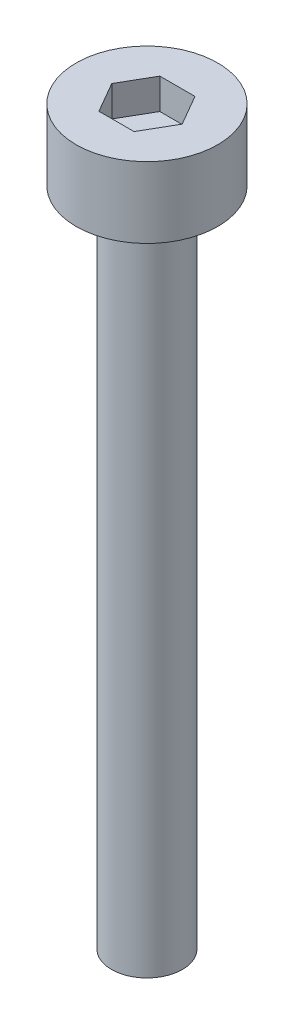
ISO-10303-21;
HEADER;
FILE_DESCRIPTION(('STEP AP214'),'2;1');
FILE_NAME('part.step','',(''),(''),'','','');
FILE_SCHEMA(('AUTOMOTIVE_DESIGN { 1 0 10303 214 1 1 1 1 }'));
ENDSEC;
DATA;
#1=APPLICATION_CONTEXT('core data for automotive mechanical design processes');
#2=APPLICATION_PROTOCOL_DEFINITION('international standard','automotive_design',2000,#1);
#3=PRODUCT_CONTEXT('',#1,'mechanical');
#4=PRODUCT('Part','Part','',(#3));
#5=PRODUCT_RELATED_PRODUCT_CATEGORY('part','',(#4));
#6=PRODUCT_DEFINITION_FORMATION('','',#4);
#7=PRODUCT_DEFINITION_CONTEXT('part definition',#1,'design');
#8=PRODUCT_DEFINITION('design','',#6,#7);
#9=PRODUCT_DEFINITION_SHAPE('','',#8);
#10=(LENGTH_UNIT() NAMED_UNIT(*) SI_UNIT(.MILLI.,.METRE.));
#11=(NAMED_UNIT(*) PLANE_ANGLE_UNIT() SI_UNIT($,.RADIAN.));
#12=(NAMED_UNIT(*) SI_UNIT($,.STERADIAN.) SOLID_ANGLE_UNIT());
#13=UNCERTAINTY_MEASURE_WITH_UNIT(LENGTH_MEASURE(1.E-05),#10,'distance_accuracy_value','');
#14=(GEOMETRIC_REPRESENTATION_CONTEXT(3) GLOBAL_UNCERTAINTY_ASSIGNED_CONTEXT((#13)) GLOBAL_UNIT_ASSIGNED_CONTEXT((#10,
#11,#12)) REPRESENTATION_CONTEXT('',''));
#15=CARTESIAN_POINT('',(0.,0.,0.));
#16=DIRECTION('',(0.,0.,1.));
#17=DIRECTION('',(1.,0.,0.));
#18=AXIS2_PLACEMENT_3D('',#15,#16,#17);
#19=CARTESIAN_POINT('',(0.,28.,0.));
#20=DIRECTION('',(0.,-1.,0.));
#21=DIRECTION('',(0.,0.,-1.));
#22=AXIS2_PLACEMENT_3D('',#19,#20,#21);
#23=CYLINDRICAL_SURFACE('',#22,1.5);
#24=CARTESIAN_POINT('',(0.,28.,0.));
#25=DIRECTION('',(0.,1.,0.));
#26=DIRECTION('',(0.,0.,1.));
#27=AXIS2_PLACEMENT_3D('',#24,#25,#26);
#28=CIRCLE('',#27,1.5);
#29=CARTESIAN_POINT('',(0.,28.,1.5));
#30=VERTEX_POINT('',#29);
#31=EDGE_CURVE('E11',#30,#30,#28,.T.);
#32=ORIENTED_EDGE('',*,*,#31,.F.);
#33=EDGE_LOOP('',(#32));
#34=FACE_BOUND('',#33,.T.);
#35=CARTESIAN_POINT('',(0.,0.,0.));
#36=DIRECTION('',(0.,1.,0.));
#37=DIRECTION('',(0.,0.,1.));
#38=AXIS2_PLACEMENT_3D('',#35,#36,#37);
#39=CIRCLE('',#38,1.5);
#40=CARTESIAN_POINT('',(0.,0.,1.5));
#41=VERTEX_POINT('',#40);
#42=EDGE_CURVE('E38',#41,#41,#39,.T.);
#43=ORIENTED_EDGE('',*,*,#42,.T.);
#44=EDGE_LOOP('',(#43));
#45=FACE_BOUND('',#44,.T.);
#46=ADVANCED_FACE('F35',(#34,#45),#23,.T.);
#47=CARTESIAN_POINT('',(0.,0.,0.));
#48=DIRECTION('',(0.,1.,0.));
#49=DIRECTION('',(0.,0.,1.));
#50=AXIS2_PLACEMENT_3D('',#47,#48,#49);
#51=PLANE('',#50);
#52=ORIENTED_EDGE('',*,*,#42,.F.);
#53=EDGE_LOOP('',(#52));
#54=FACE_BOUND('',#53,.T.);
#55=ADVANCED_FACE('F167',(#54),#51,.F.);
#56=CARTESIAN_POINT('',(0.,31.,0.));
#57=DIRECTION('',(0.,-1.,0.));
#58=DIRECTION('',(0.,0.,-1.));
#59=AXIS2_PLACEMENT_3D('',#56,#57,#58);
#60=CYLINDRICAL_SURFACE('',#59,3.);
#61=CARTESIAN_POINT('',(0.,31.,0.));
#62=DIRECTION('',(0.,1.,0.));
#63=DIRECTION('',(0.,0.,1.));
#64=AXIS2_PLACEMENT_3D('',#61,#62,#63);
#65=CIRCLE('',#64,3.);
#66=CARTESIAN_POINT('',(0.,31.,3.));
#67=VERTEX_POINT('',#66);
#68=EDGE_CURVE('E142',#67,#67,#65,.T.);
#69=ORIENTED_EDGE('',*,*,#68,.F.);
#70=EDGE_LOOP('',(#69));
#71=FACE_BOUND('',#70,.T.);
#72=CARTESIAN_POINT('',(0.,28.,0.));
#73=DIRECTION('',(0.,1.,0.));
#74=DIRECTION('',(0.,0.,1.));
#75=AXIS2_PLACEMENT_3D('',#72,#73,#74);
#76=CIRCLE('',#75,3.);
#77=CARTESIAN_POINT('',(0.,28.,3.));
#78=VERTEX_POINT('',#77);
#79=EDGE_CURVE('E136',#78,#78,#76,.T.);
#80=ORIENTED_EDGE('',*,*,#79,.T.);
#81=EDGE_LOOP('',(#80));
#82=FACE_BOUND('',#81,.T.);
#83=ADVANCED_FACE('F149',(#71,#82),#60,.T.);
#84=CARTESIAN_POINT('',(0.,31.,0.));
#85=DIRECTION('',(0.,1.,0.));
#86=DIRECTION('',(0.,0.,1.));
#87=AXIS2_PLACEMENT_3D('',#84,#85,#86);
#88=PLANE('',#87);
#89=DIRECTION('',(0.5,0.,-0.866025403784439));
#90=VECTOR('',#89,1.);
#91=CARTESIAN_POINT('',(0.744781847254617,31.,1.29));
#92=LINE('',#91,#90);
#93=CARTESIAN_POINT('',(0.744781847254617,31.,1.29));
#94=VERTEX_POINT('',#93);
#95=CARTESIAN_POINT('',(1.48956369450923,31.,0.));
#96=VERTEX_POINT('',#95);
#97=EDGE_CURVE('E49',#94,#96,#92,.T.);
#98=ORIENTED_EDGE('',*,*,#97,.F.);
#99=DIRECTION('',(1.,0.,0.));
#100=VECTOR('',#99,1.);
#101=CARTESIAN_POINT('',(-0.744781847254617,31.,1.29));
#102=LINE('',#101,#100);
#103=CARTESIAN_POINT('',(-0.744781847254617,31.,1.29));
#104=VERTEX_POINT('',#103);
#105=EDGE_CURVE('E132',#104,#94,#102,.T.);
#106=ORIENTED_EDGE('',*,*,#105,.F.);
#107=DIRECTION('',(0.5,0.,0.866025403784439));
#108=VECTOR('',#107,1.);
#109=CARTESIAN_POINT('',(-1.48956369450923,31.,0.));
#110=LINE('',#109,#108);
#111=CARTESIAN_POINT('',(-1.48956369450923,31.,0.));
#112=VERTEX_POINT('',#111);
#113=EDGE_CURVE('E130',#112,#104,#110,.T.);
#114=ORIENTED_EDGE('',*,*,#113,.F.);
#115=DIRECTION('',(-0.5,0.,0.866025403784439));
#116=VECTOR('',#115,1.);
#117=CARTESIAN_POINT('',(-0.744781847254617,31.,-1.29));
#118=LINE('',#117,#116);
#119=CARTESIAN_POINT('',(-0.744781847254617,31.,-1.29));
#120=VERTEX_POINT('',#119);
#121=EDGE_CURVE('E97',#120,#112,#118,.T.);
#122=ORIENTED_EDGE('',*,*,#121,.F.);
#123=DIRECTION('',(-1.,0.,0.));
#124=VECTOR('',#123,1.);
#125=CARTESIAN_POINT('',(0.744781847254618,31.,-1.29));
#126=LINE('',#125,#124);
#127=CARTESIAN_POINT('',(0.744781847254618,31.,-1.29));
#128=VERTEX_POINT('',#127);
#129=EDGE_CURVE('E126',#128,#120,#126,.T.);
#130=ORIENTED_EDGE('',*,*,#129,.F.);
#131=DIRECTION('',(-0.5,0.,-0.866025403784439));
#132=VECTOR('',#131,1.);
#133=CARTESIAN_POINT('',(1.48956369450923,31.,0.));
#134=LINE('',#133,#132);
#135=EDGE_CURVE('E123',#96,#128,#134,.T.);
#136=ORIENTED_EDGE('',*,*,#135,.F.);
#137=EDGE_LOOP('',(#98,#106,#114,#122,#130,#136));
#138=FACE_BOUND('',#137,.T.);
#139=ORIENTED_EDGE('',*,*,#68,.T.);
#140=EDGE_LOOP('',(#139));
#141=FACE_BOUND('',#140,.T.);
#142=ADVANCED_FACE('F154',(#138,#141),#88,.T.);
#143=CARTESIAN_POINT('',(0.,28.,0.));
#144=DIRECTION('',(0.,1.,0.));
#145=DIRECTION('',(0.,0.,1.));
#146=AXIS2_PLACEMENT_3D('',#143,#144,#145);
#147=PLANE('',#146);
#148=ORIENTED_EDGE('',*,*,#31,.T.);
#149=EDGE_LOOP('',(#148));
#150=FACE_BOUND('',#149,.T.);
#151=ORIENTED_EDGE('',*,*,#79,.F.);
#152=EDGE_LOOP('',(#151));
#153=FACE_BOUND('',#152,.T.);
#154=ADVANCED_FACE('F151',(#150,#153),#147,.F.);
#155=CARTESIAN_POINT('',(0.744781847254617,29.7,1.29));
#156=DIRECTION('',(0.866025403784439,0.,0.5));
#157=DIRECTION('',(0.5,0.,-0.866025403784439));
#158=AXIS2_PLACEMENT_3D('',#155,#156,#157);
#159=PLANE('',#158);
#160=ORIENTED_EDGE('',*,*,#97,.T.);
#161=DIRECTION('',(0.,1.,0.));
#162=VECTOR('',#161,1.);
#163=CARTESIAN_POINT('',(1.48956369450923,29.7,0.));
#164=LINE('',#163,#162);
#165=CARTESIAN_POINT('',(1.48956369450923,29.7,0.));
#166=VERTEX_POINT('',#165);
#167=EDGE_CURVE('E79',#166,#96,#164,.T.);
#168=ORIENTED_EDGE('',*,*,#167,.F.);
#169=DIRECTION('',(0.5,0.,-0.866025403784439));
#170=VECTOR('',#169,1.);
#171=CARTESIAN_POINT('',(0.744781847254617,29.7,1.29));
#172=LINE('',#171,#170);
#173=CARTESIAN_POINT('',(0.744781847254617,29.7,1.29));
#174=VERTEX_POINT('',#173);
#175=EDGE_CURVE('E134',#174,#166,#172,.T.);
#176=ORIENTED_EDGE('',*,*,#175,.F.);
#177=DIRECTION('',(0.,1.,0.));
#178=VECTOR('',#177,1.);
#179=CARTESIAN_POINT('',(0.744781847254617,29.7,1.29));
#180=LINE('',#179,#178);
#181=EDGE_CURVE('E57',#174,#94,#180,.T.);
#182=ORIENTED_EDGE('',*,*,#181,.T.);
#183=EDGE_LOOP('',(#160,#168,#176,#182));
#184=FACE_BOUND('',#183,.T.);
#185=ADVANCED_FACE('F153',(#184),#159,.F.);
#186=CARTESIAN_POINT('',(-0.744781847254617,29.7,1.29));
#187=DIRECTION('',(0.,0.,1.));
#188=DIRECTION('',(1.,0.,0.));
#189=AXIS2_PLACEMENT_3D('',#186,#187,#188);
#190=PLANE('',#189);
#191=ORIENTED_EDGE('',*,*,#105,.T.);
#192=ORIENTED_EDGE('',*,*,#181,.F.);
#193=DIRECTION('',(1.,0.,0.));
#194=VECTOR('',#193,1.);
#195=CARTESIAN_POINT('',(-0.744781847254617,29.7,1.29));
#196=LINE('',#195,#194);
#197=CARTESIAN_POINT('',(-0.744781847254617,29.7,1.29));
#198=VERTEX_POINT('',#197);
#199=EDGE_CURVE('E109',#198,#174,#196,.T.);
#200=ORIENTED_EDGE('',*,*,#199,.F.);
#201=DIRECTION('',(0.,1.,0.));
#202=VECTOR('',#201,1.);
#203=CARTESIAN_POINT('',(-0.744781847254617,29.7,1.29));
#204=LINE('',#203,#202);
#205=EDGE_CURVE('E101',#198,#104,#204,.T.);
#206=ORIENTED_EDGE('',*,*,#205,.T.);
#207=EDGE_LOOP('',(#191,#192,#200,#206));
#208=FACE_BOUND('',#207,.T.);
#209=ADVANCED_FACE('F161',(#208),#190,.F.);
#210=CARTESIAN_POINT('',(-1.48956369450923,29.7,0.));
#211=DIRECTION('',(-0.866025403784439,0.,0.5));
#212=DIRECTION('',(0.5,0.,0.866025403784439));
#213=AXIS2_PLACEMENT_3D('',#210,#211,#212);
#214=PLANE('',#213);
#215=ORIENTED_EDGE('',*,*,#113,.T.);
#216=ORIENTED_EDGE('',*,*,#205,.F.);
#217=DIRECTION('',(0.5,0.,0.866025403784439));
#218=VECTOR('',#217,1.);
#219=CARTESIAN_POINT('',(-1.48956369450923,29.7,0.));
#220=LINE('',#219,#218);
#221=CARTESIAN_POINT('',(-1.48956369450923,29.7,0.));
#222=VERTEX_POINT('',#221);
#223=EDGE_CURVE('E105',#222,#198,#220,.T.);
#224=ORIENTED_EDGE('',*,*,#223,.F.);
#225=DIRECTION('',(0.,1.,0.));
#226=VECTOR('',#225,1.);
#227=CARTESIAN_POINT('',(-1.48956369450923,29.7,0.));
#228=LINE('',#227,#226);
#229=EDGE_CURVE('E90',#222,#112,#228,.T.);
#230=ORIENTED_EDGE('',*,*,#229,.T.);
#231=EDGE_LOOP('',(#215,#216,#224,#230));
#232=FACE_BOUND('',#231,.T.);
#233=ADVANCED_FACE('F106',(#232),#214,.F.);
#234=CARTESIAN_POINT('',(-0.744781847254617,29.7,-1.29));
#235=DIRECTION('',(-0.866025403784439,0.,-0.5));
#236=DIRECTION('',(-0.5,0.,0.866025403784439));
#237=AXIS2_PLACEMENT_3D('',#234,#235,#236);
#238=PLANE('',#237);
#239=ORIENTED_EDGE('',*,*,#121,.T.);
#240=ORIENTED_EDGE('',*,*,#229,.F.);
#241=DIRECTION('',(-0.5,0.,0.866025403784439));
#242=VECTOR('',#241,1.);
#243=CARTESIAN_POINT('',(-0.744781847254617,29.7,-1.29));
#244=LINE('',#243,#242);
#245=CARTESIAN_POINT('',(-0.744781847254617,29.7,-1.29));
#246=VERTEX_POINT('',#245);
#247=EDGE_CURVE('E94',#246,#222,#244,.T.);
#248=ORIENTED_EDGE('',*,*,#247,.F.);
#249=DIRECTION('',(0.,1.,0.));
#250=VECTOR('',#249,1.);
#251=CARTESIAN_POINT('',(-0.744781847254617,29.7,-1.29));
#252=LINE('',#251,#250);
#253=EDGE_CURVE('E102',#246,#120,#252,.T.);
#254=ORIENTED_EDGE('',*,*,#253,.T.);
#255=EDGE_LOOP('',(#239,#240,#248,#254));
#256=FACE_BOUND('',#255,.T.);
#257=ADVANCED_FACE('F92',(#256),#238,.F.);
#258=CARTESIAN_POINT('',(0.744781847254618,29.7,-1.29));
#259=DIRECTION('',(0.,0.,-1.));
#260=DIRECTION('',(-1.,0.,0.));
#261=AXIS2_PLACEMENT_3D('',#258,#259,#260);
#262=PLANE('',#261);
#263=ORIENTED_EDGE('',*,*,#129,.T.);
#264=ORIENTED_EDGE('',*,*,#253,.F.);
#265=DIRECTION('',(-1.,0.,0.));
#266=VECTOR('',#265,1.);
#267=CARTESIAN_POINT('',(0.744781847254618,29.7,-1.29));
#268=LINE('',#267,#266);
#269=CARTESIAN_POINT('',(0.744781847254618,29.7,-1.29));
#270=VERTEX_POINT('',#269);
#271=EDGE_CURVE('E115',#270,#246,#268,.T.);
#272=ORIENTED_EDGE('',*,*,#271,.F.);
#273=DIRECTION('',(0.,1.,0.));
#274=VECTOR('',#273,1.);
#275=CARTESIAN_POINT('',(0.744781847254618,29.7,-1.29));
#276=LINE('',#275,#274);
#277=EDGE_CURVE('E139',#270,#128,#276,.T.);
#278=ORIENTED_EDGE('',*,*,#277,.T.);
#279=EDGE_LOOP('',(#263,#264,#272,#278));
#280=FACE_BOUND('',#279,.T.);
#281=ADVANCED_FACE('F222',(#280),#262,.F.);
#282=CARTESIAN_POINT('',(1.48956369450923,29.7,0.));
#283=DIRECTION('',(0.866025403784439,0.,-0.5));
#284=DIRECTION('',(-0.5,0.,-0.866025403784439));
#285=AXIS2_PLACEMENT_3D('',#282,#283,#284);
#286=PLANE('',#285);
#287=ORIENTED_EDGE('',*,*,#135,.T.);
#288=ORIENTED_EDGE('',*,*,#277,.F.);
#289=DIRECTION('',(-0.5,0.,-0.866025403784439));
#290=VECTOR('',#289,1.);
#291=CARTESIAN_POINT('',(1.48956369450923,29.7,0.));
#292=LINE('',#291,#290);
#293=EDGE_CURVE('E117',#166,#270,#292,.T.);
#294=ORIENTED_EDGE('',*,*,#293,.F.);
#295=ORIENTED_EDGE('',*,*,#167,.T.);
#296=EDGE_LOOP('',(#287,#288,#294,#295));
#297=FACE_BOUND('',#296,.T.);
#298=ADVANCED_FACE('F231',(#297),#286,.F.);
#299=CARTESIAN_POINT('',(0.,29.7,0.));
#300=DIRECTION('',(0.,1.,0.));
#301=DIRECTION('',(0.,0.,1.));
#302=AXIS2_PLACEMENT_3D('',#299,#300,#301);
#303=PLANE('',#302);
#304=ORIENTED_EDGE('',*,*,#175,.T.);
#305=ORIENTED_EDGE('',*,*,#293,.T.);
#306=ORIENTED_EDGE('',*,*,#271,.T.);
#307=ORIENTED_EDGE('',*,*,#247,.T.);
#308=ORIENTED_EDGE('',*,*,#223,.T.);
#309=ORIENTED_EDGE('',*,*,#199,.T.);
#310=EDGE_LOOP('',(#304,#305,#306,#307,#308,#309));
#311=FACE_BOUND('',#310,.T.);
#312=ADVANCED_FACE('F112',(#311),#303,.T.);
#313=CLOSED_SHELL('',(#46,#55,#83,#142,#154,#185,#209,#233,#257,#281,#298,#312));
#314=MANIFOLD_SOLID_BREP('B2',#313);
#315=ADVANCED_BREP_SHAPE_REPRESENTATION('',(#18,#314),#14);
#316=SHAPE_DEFINITION_REPRESENTATION(#9,#315);
ENDSEC;
END-ISO-10303-21;
